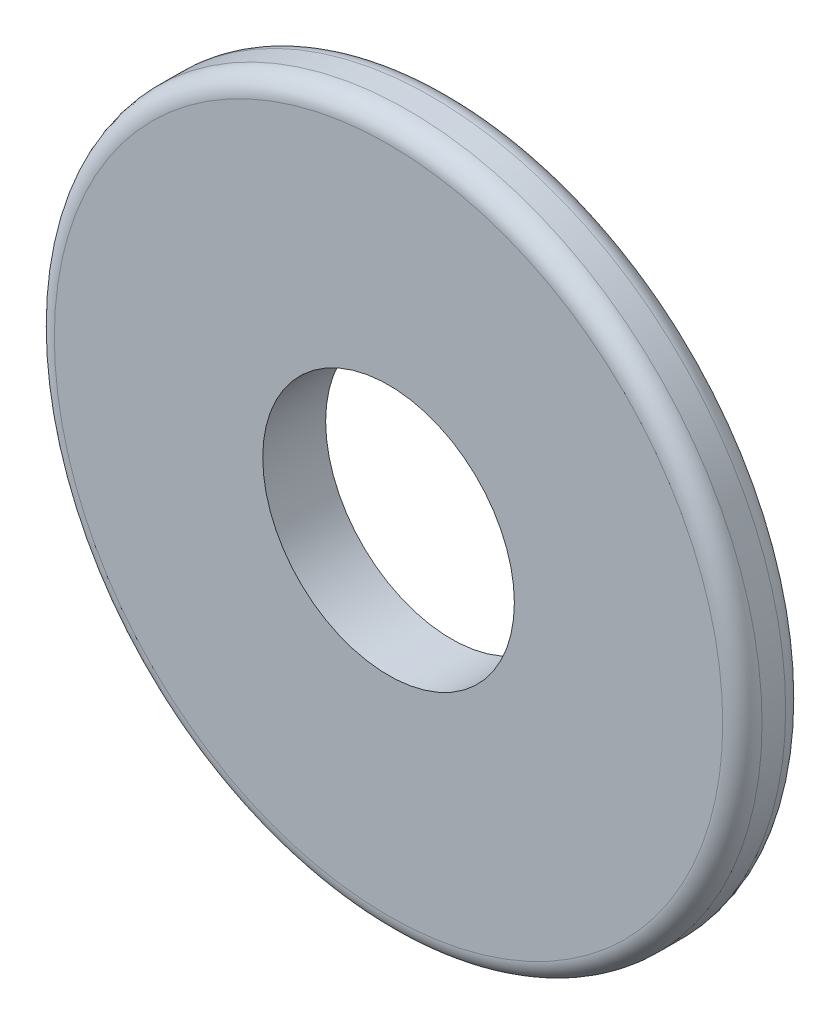
ISO-10303-21;
HEADER;
FILE_DESCRIPTION(('STEP AP214'),'2;1');
FILE_NAME('part.step','',(''),(''),'','','');
FILE_SCHEMA(('AUTOMOTIVE_DESIGN { 1 0 10303 214 1 1 1 1 }'));
ENDSEC;
DATA;
#1=APPLICATION_CONTEXT('core data for automotive mechanical design processes');
#2=APPLICATION_PROTOCOL_DEFINITION('international standard','automotive_design',2000,#1);
#3=PRODUCT_CONTEXT('',#1,'mechanical');
#4=PRODUCT('Part','Part','',(#3));
#5=PRODUCT_RELATED_PRODUCT_CATEGORY('part','',(#4));
#6=PRODUCT_DEFINITION_FORMATION('','',#4);
#7=PRODUCT_DEFINITION_CONTEXT('part definition',#1,'design');
#8=PRODUCT_DEFINITION('design','',#6,#7);
#9=PRODUCT_DEFINITION_SHAPE('','',#8);
#10=(LENGTH_UNIT() NAMED_UNIT(*) SI_UNIT(.MILLI.,.METRE.));
#11=(NAMED_UNIT(*) PLANE_ANGLE_UNIT() SI_UNIT($,.RADIAN.));
#12=(NAMED_UNIT(*) SI_UNIT($,.STERADIAN.) SOLID_ANGLE_UNIT());
#13=UNCERTAINTY_MEASURE_WITH_UNIT(LENGTH_MEASURE(1.E-05),#10,'distance_accuracy_value','');
#14=(GEOMETRIC_REPRESENTATION_CONTEXT(3) GLOBAL_UNCERTAINTY_ASSIGNED_CONTEXT((#13)) GLOBAL_UNIT_ASSIGNED_CONTEXT((#10,
#11,#12)) REPRESENTATION_CONTEXT('',''));
#15=CARTESIAN_POINT('',(0.,0.,0.));
#16=DIRECTION('',(0.,0.,1.));
#17=DIRECTION('',(1.,0.,0.));
#18=AXIS2_PLACEMENT_3D('',#15,#16,#17);
#19=CARTESIAN_POINT('',(0.,0.,1.6));
#20=DIRECTION('',(0.,0.,-1.));
#21=DIRECTION('',(-1.,0.,0.));
#22=AXIS2_PLACEMENT_3D('',#19,#20,#21);
#23=CYLINDRICAL_SURFACE('',#22,9.);
#24=CARTESIAN_POINT('',(0.,0.,0.5));
#25=DIRECTION('',(0.,0.,1.));
#26=DIRECTION('',(1.,0.,0.));
#27=AXIS2_PLACEMENT_3D('',#24,#25,#26);
#28=CIRCLE('',#27,9.);
#29=CARTESIAN_POINT('',(9.,0.,0.5));
#30=VERTEX_POINT('',#29);
#31=EDGE_CURVE('E42',#30,#30,#28,.T.);
#32=ORIENTED_EDGE('',*,*,#31,.T.);
#33=EDGE_LOOP('',(#32));
#34=FACE_BOUND('',#33,.T.);
#35=CARTESIAN_POINT('',(0.,0.,1.1));
#36=DIRECTION('',(0.,0.,1.));
#37=DIRECTION('',(1.,0.,0.));
#38=AXIS2_PLACEMENT_3D('',#35,#36,#37);
#39=CIRCLE('',#38,9.);
#40=CARTESIAN_POINT('',(9.,0.,1.1));
#41=VERTEX_POINT('',#40);
#42=EDGE_CURVE('E46',#41,#41,#39,.F.);
#43=ORIENTED_EDGE('',*,*,#42,.T.);
#44=EDGE_LOOP('',(#43));
#45=FACE_BOUND('',#44,.T.);
#46=ADVANCED_FACE('F31',(#34,#45),#23,.T.);
#47=CARTESIAN_POINT('',(0.,0.,1.6));
#48=DIRECTION('',(0.,0.,1.));
#49=DIRECTION('',(1.,0.,0.));
#50=AXIS2_PLACEMENT_3D('',#47,#48,#49);
#51=PLANE('',#50);
#52=CARTESIAN_POINT('',(0.,0.,1.6));
#53=DIRECTION('',(0.,0.,1.));
#54=DIRECTION('',(1.,0.,0.));
#55=AXIS2_PLACEMENT_3D('',#52,#53,#54);
#56=CIRCLE('',#55,8.5);
#57=CARTESIAN_POINT('',(8.5,0.,1.6));
#58=VERTEX_POINT('',#57);
#59=EDGE_CURVE('E10',#58,#58,#56,.T.);
#60=ORIENTED_EDGE('',*,*,#59,.T.);
#61=EDGE_LOOP('',(#60));
#62=FACE_BOUND('',#61,.T.);
#63=CARTESIAN_POINT('',(0.,0.,1.6));
#64=DIRECTION('',(0.,0.,1.));
#65=DIRECTION('',(1.,0.,0.));
#66=AXIS2_PLACEMENT_3D('',#63,#64,#65);
#67=CIRCLE('',#66,3.2);
#68=CARTESIAN_POINT('',(3.2,0.,1.6));
#69=VERTEX_POINT('',#68);
#70=EDGE_CURVE('E52',#69,#69,#67,.T.);
#71=ORIENTED_EDGE('',*,*,#70,.F.);
#72=EDGE_LOOP('',(#71));
#73=FACE_BOUND('',#72,.T.);
#74=ADVANCED_FACE('F67',(#62,#73),#51,.T.);
#75=CARTESIAN_POINT('',(0.,0.,0.));
#76=DIRECTION('',(0.,0.,1.));
#77=DIRECTION('',(1.,0.,0.));
#78=AXIS2_PLACEMENT_3D('',#75,#76,#77);
#79=PLANE('',#78);
#80=CARTESIAN_POINT('',(0.,0.,0.));
#81=DIRECTION('',(0.,0.,1.));
#82=DIRECTION('',(1.,0.,0.));
#83=AXIS2_PLACEMENT_3D('',#80,#81,#82);
#84=CIRCLE('',#83,8.5);
#85=CARTESIAN_POINT('',(8.5,0.,0.));
#86=VERTEX_POINT('',#85);
#87=EDGE_CURVE('E38',#86,#86,#84,.F.);
#88=ORIENTED_EDGE('',*,*,#87,.T.);
#89=EDGE_LOOP('',(#88));
#90=FACE_BOUND('',#89,.T.);
#91=CARTESIAN_POINT('',(0.,0.,0.));
#92=DIRECTION('',(0.,0.,1.));
#93=DIRECTION('',(1.,0.,0.));
#94=AXIS2_PLACEMENT_3D('',#91,#92,#93);
#95=CIRCLE('',#94,3.2);
#96=CARTESIAN_POINT('',(3.2,0.,0.));
#97=VERTEX_POINT('',#96);
#98=EDGE_CURVE('E51',#97,#97,#95,.T.);
#99=ORIENTED_EDGE('',*,*,#98,.T.);
#100=EDGE_LOOP('',(#99));
#101=FACE_BOUND('',#100,.T.);
#102=ADVANCED_FACE('F58',(#90,#101),#79,.F.);
#103=CARTESIAN_POINT('',(0.,0.,0.));
#104=DIRECTION('',(0.,0.,1.));
#105=DIRECTION('',(1.,0.,0.));
#106=AXIS2_PLACEMENT_3D('',#103,#104,#105);
#107=CYLINDRICAL_SURFACE('',#106,3.2);
#108=ORIENTED_EDGE('',*,*,#98,.F.);
#109=EDGE_LOOP('',(#108));
#110=FACE_BOUND('',#109,.T.);
#111=ORIENTED_EDGE('',*,*,#70,.T.);
#112=EDGE_LOOP('',(#111));
#113=FACE_BOUND('',#112,.T.);
#114=ADVANCED_FACE('F60',(#110,#113),#107,.F.);
#115=CARTESIAN_POINT('',(0.,0.,0.5));
#116=DIRECTION('',(0.,0.,1.));
#117=DIRECTION('',(1.,0.,0.));
#118=AXIS2_PLACEMENT_3D('',#115,#116,#117);
#119=TOROIDAL_SURFACE('',#118,8.5,0.5);
#120=ORIENTED_EDGE('',*,*,#87,.F.);
#121=EDGE_LOOP('',(#120));
#122=FACE_BOUND('',#121,.T.);
#123=ORIENTED_EDGE('',*,*,#31,.F.);
#124=EDGE_LOOP('',(#123));
#125=FACE_BOUND('',#124,.T.);
#126=ADVANCED_FACE('F63',(#122,#125),#119,.T.);
#127=CARTESIAN_POINT('',(0.,0.,1.1));
#128=DIRECTION('',(0.,0.,1.));
#129=DIRECTION('',(1.,0.,0.));
#130=AXIS2_PLACEMENT_3D('',#127,#128,#129);
#131=TOROIDAL_SURFACE('',#130,8.5,0.5);
#132=ORIENTED_EDGE('',*,*,#42,.F.);
#133=EDGE_LOOP('',(#132));
#134=FACE_BOUND('',#133,.T.);
#135=ORIENTED_EDGE('',*,*,#59,.F.);
#136=EDGE_LOOP('',(#135));
#137=FACE_BOUND('',#136,.T.);
#138=ADVANCED_FACE('F33',(#134,#137),#131,.T.);
#139=CLOSED_SHELL('',(#46,#74,#102,#114,#126,#138));
#140=MANIFOLD_SOLID_BREP('B2',#139);
#141=ADVANCED_BREP_SHAPE_REPRESENTATION('',(#18,#140),#14);
#142=SHAPE_DEFINITION_REPRESENTATION(#9,#141);
ENDSEC;
END-ISO-10303-21;
